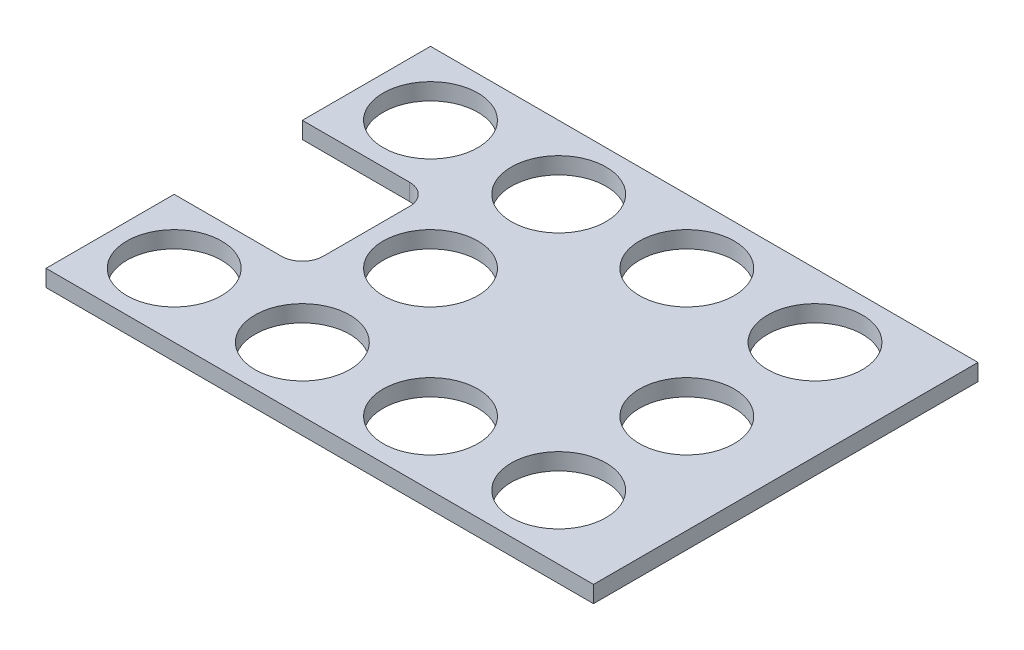
ISO-10303-21;
HEADER;
FILE_DESCRIPTION(('STEP AP214'),'2;1');
FILE_NAME('part.step','',(''),(''),'','','');
FILE_SCHEMA(('AUTOMOTIVE_DESIGN { 1 0 10303 214 1 1 1 1 }'));
ENDSEC;
DATA;
#1=APPLICATION_CONTEXT('core data for automotive mechanical design processes');
#2=APPLICATION_PROTOCOL_DEFINITION('international standard','automotive_design',2000,#1);
#3=PRODUCT_CONTEXT('',#1,'mechanical');
#4=PRODUCT('Part','Part','',(#3));
#5=PRODUCT_RELATED_PRODUCT_CATEGORY('part','',(#4));
#6=PRODUCT_DEFINITION_FORMATION('','',#4);
#7=PRODUCT_DEFINITION_CONTEXT('part definition',#1,'design');
#8=PRODUCT_DEFINITION('design','',#6,#7);
#9=PRODUCT_DEFINITION_SHAPE('','',#8);
#10=(LENGTH_UNIT() NAMED_UNIT(*) SI_UNIT(.MILLI.,.METRE.));
#11=(NAMED_UNIT(*) PLANE_ANGLE_UNIT() SI_UNIT($,.RADIAN.));
#12=(NAMED_UNIT(*) SI_UNIT($,.STERADIAN.) SOLID_ANGLE_UNIT());
#13=UNCERTAINTY_MEASURE_WITH_UNIT(LENGTH_MEASURE(1.E-05),#10,'distance_accuracy_value','');
#14=(GEOMETRIC_REPRESENTATION_CONTEXT(3) GLOBAL_UNCERTAINTY_ASSIGNED_CONTEXT((#13)) GLOBAL_UNIT_ASSIGNED_CONTEXT((#10,
#11,#12)) REPRESENTATION_CONTEXT('',''));
#15=CARTESIAN_POINT('',(0.,0.,0.));
#16=DIRECTION('',(0.,0.,1.));
#17=DIRECTION('',(1.,0.,0.));
#18=AXIS2_PLACEMENT_3D('',#15,#16,#17);
#19=CARTESIAN_POINT('',(0.,12.,0.));
#20=DIRECTION('',(-1.,0.,0.));
#21=DIRECTION('',(0.,0.,1.));
#22=AXIS2_PLACEMENT_3D('',#19,#20,#21);
#23=PLANE('',#22);
#24=DIRECTION('',(0.,0.,-1.));
#25=VECTOR('',#24,1.);
#26=CARTESIAN_POINT('',(0.,12.,0.));
#27=LINE('',#26,#25);
#28=CARTESIAN_POINT('',(0.,12.,0.));
#29=VERTEX_POINT('',#28);
#30=CARTESIAN_POINT('',(0.,12.,-92.));
#31=VERTEX_POINT('',#30);
#32=EDGE_CURVE('E234',#29,#31,#27,.T.);
#33=ORIENTED_EDGE('',*,*,#32,.T.);
#34=DIRECTION('',(0.,-1.,0.));
#35=VECTOR('',#34,1.);
#36=CARTESIAN_POINT('',(0.,142.107647738325,-92.));
#37=LINE('',#36,#35);
#38=CARTESIAN_POINT('',(0.,0.,-92.));
#39=VERTEX_POINT('',#38);
#40=EDGE_CURVE('E160',#31,#39,#37,.T.);
#41=ORIENTED_EDGE('',*,*,#40,.T.);
#42=DIRECTION('',(0.,0.,-1.));
#43=VECTOR('',#42,1.);
#44=CARTESIAN_POINT('',(0.,0.,0.));
#45=LINE('',#44,#43);
#46=CARTESIAN_POINT('',(0.,0.,0.));
#47=VERTEX_POINT('',#46);
#48=EDGE_CURVE('E228',#47,#39,#45,.T.);
#49=ORIENTED_EDGE('',*,*,#48,.F.);
#50=DIRECTION('',(0.,-1.,0.));
#51=VECTOR('',#50,1.);
#52=CARTESIAN_POINT('',(0.,12.,0.));
#53=LINE('',#52,#51);
#54=EDGE_CURVE('E57',#29,#47,#53,.T.);
#55=ORIENTED_EDGE('',*,*,#54,.F.);
#56=EDGE_LOOP('',(#33,#41,#49,#55));
#57=FACE_BOUND('',#56,.T.);
#58=ADVANCED_FACE('F33',(#57),#23,.T.);
#59=CARTESIAN_POINT('',(0.,12.,0.));
#60=DIRECTION('',(0.,0.,-1.));
#61=DIRECTION('',(-1.,0.,0.));
#62=AXIS2_PLACEMENT_3D('',#59,#60,#61);
#63=PLANE('',#62);
#64=DIRECTION('',(1.,0.,0.));
#65=VECTOR('',#64,1.);
#66=CARTESIAN_POINT('',(0.,0.,0.));
#67=LINE('',#66,#65);
#68=CARTESIAN_POINT('',(393.,0.,0.));
#69=VERTEX_POINT('',#68);
#70=EDGE_CURVE('E221',#47,#69,#67,.T.);
#71=ORIENTED_EDGE('',*,*,#70,.T.);
#72=DIRECTION('',(0.,-1.,0.));
#73=VECTOR('',#72,1.);
#74=CARTESIAN_POINT('',(393.,12.,0.));
#75=LINE('',#74,#73);
#76=CARTESIAN_POINT('',(393.,12.,0.));
#77=VERTEX_POINT('',#76);
#78=EDGE_CURVE('E11',#77,#69,#75,.T.);
#79=ORIENTED_EDGE('',*,*,#78,.F.);
#80=DIRECTION('',(1.,0.,0.));
#81=VECTOR('',#80,1.);
#82=CARTESIAN_POINT('',(0.,12.,0.));
#83=LINE('',#82,#81);
#84=EDGE_CURVE('E226',#29,#77,#83,.T.);
#85=ORIENTED_EDGE('',*,*,#84,.F.);
#86=ORIENTED_EDGE('',*,*,#54,.T.);
#87=EDGE_LOOP('',(#71,#79,#85,#86));
#88=FACE_BOUND('',#87,.T.);
#89=ADVANCED_FACE('F35',(#88),#63,.F.);
#90=CARTESIAN_POINT('',(393.,12.,0.));
#91=DIRECTION('',(-1.,0.,0.));
#92=DIRECTION('',(0.,0.,1.));
#93=AXIS2_PLACEMENT_3D('',#90,#91,#92);
#94=PLANE('',#93);
#95=DIRECTION('',(0.,0.,-1.));
#96=VECTOR('',#95,1.);
#97=CARTESIAN_POINT('',(393.,0.,0.));
#98=LINE('',#97,#96);
#99=CARTESIAN_POINT('',(393.,0.,-276.));
#100=VERTEX_POINT('',#99);
#101=EDGE_CURVE('E237',#69,#100,#98,.T.);
#102=ORIENTED_EDGE('',*,*,#101,.T.);
#103=DIRECTION('',(0.,-1.,0.));
#104=VECTOR('',#103,1.);
#105=CARTESIAN_POINT('',(393.,12.,-276.));
#106=LINE('',#105,#104);
#107=CARTESIAN_POINT('',(393.,12.,-276.));
#108=VERTEX_POINT('',#107);
#109=EDGE_CURVE('E41',#108,#100,#106,.T.);
#110=ORIENTED_EDGE('',*,*,#109,.F.);
#111=DIRECTION('',(0.,0.,-1.));
#112=VECTOR('',#111,1.);
#113=CARTESIAN_POINT('',(393.,12.,0.));
#114=LINE('',#113,#112);
#115=EDGE_CURVE('E83',#77,#108,#114,.T.);
#116=ORIENTED_EDGE('',*,*,#115,.F.);
#117=ORIENTED_EDGE('',*,*,#78,.T.);
#118=EDGE_LOOP('',(#102,#110,#116,#117));
#119=FACE_BOUND('',#118,.T.);
#120=ADVANCED_FACE('F254',(#119),#94,.F.);
#121=CARTESIAN_POINT('',(0.,12.,-276.));
#122=DIRECTION('',(0.,0.,-1.));
#123=DIRECTION('',(-1.,0.,0.));
#124=AXIS2_PLACEMENT_3D('',#121,#122,#123);
#125=PLANE('',#124);
#126=DIRECTION('',(1.,0.,0.));
#127=VECTOR('',#126,1.);
#128=CARTESIAN_POINT('',(0.,0.,-276.));
#129=LINE('',#128,#127);
#130=CARTESIAN_POINT('',(0.,0.,-276.));
#131=VERTEX_POINT('',#130);
#132=EDGE_CURVE('E240',#131,#100,#129,.T.);
#133=ORIENTED_EDGE('',*,*,#132,.F.);
#134=DIRECTION('',(0.,-1.,0.));
#135=VECTOR('',#134,1.);
#136=CARTESIAN_POINT('',(0.,12.,-276.));
#137=LINE('',#136,#135);
#138=CARTESIAN_POINT('',(0.,12.,-276.));
#139=VERTEX_POINT('',#138);
#140=EDGE_CURVE('E247',#139,#131,#137,.T.);
#141=ORIENTED_EDGE('',*,*,#140,.F.);
#142=DIRECTION('',(1.,0.,0.));
#143=VECTOR('',#142,1.);
#144=CARTESIAN_POINT('',(0.,12.,-276.));
#145=LINE('',#144,#143);
#146=EDGE_CURVE('E230',#139,#108,#145,.T.);
#147=ORIENTED_EDGE('',*,*,#146,.T.);
#148=ORIENTED_EDGE('',*,*,#109,.T.);
#149=EDGE_LOOP('',(#133,#141,#147,#148));
#150=FACE_BOUND('',#149,.T.);
#151=ADVANCED_FACE('F251',(#150),#125,.T.);
#152=DIRECTION('',(0.,-1.,0.));
#153=VECTOR('',#152,1.);
#154=CARTESIAN_POINT('',(0.,142.107647738325,-184.));
#155=LINE('',#154,#153);
#156=CARTESIAN_POINT('',(0.,12.,-184.));
#157=VERTEX_POINT('',#156);
#158=CARTESIAN_POINT('',(0.,0.,-184.));
#159=VERTEX_POINT('',#158);
#160=EDGE_CURVE('E154',#157,#159,#155,.T.);
#161=ORIENTED_EDGE('',*,*,#160,.F.);
#162=EDGE_CURVE('E233',#157,#139,#27,.T.);
#163=ORIENTED_EDGE('',*,*,#162,.T.);
#164=ORIENTED_EDGE('',*,*,#140,.T.);
#165=EDGE_CURVE('E243',#159,#131,#45,.T.);
#166=ORIENTED_EDGE('',*,*,#165,.F.);
#167=EDGE_LOOP('',(#161,#163,#164,#166));
#168=FACE_BOUND('',#167,.T.);
#169=ADVANCED_FACE('F264',(#168),#23,.T.);
#170=CARTESIAN_POINT('',(0.,12.,0.));
#171=DIRECTION('',(0.,1.,0.));
#172=DIRECTION('',(0.,0.,1.));
#173=AXIS2_PLACEMENT_3D('',#170,#171,#172);
#174=PLANE('',#173);
#175=CARTESIAN_POINT('',(77.,12.,-107.));
#176=DIRECTION('',(0.,1.,0.));
#177=DIRECTION('',(0.,0.,1.));
#178=AXIS2_PLACEMENT_3D('',#175,#176,#177);
#179=CIRCLE('',#178,15.);
#180=CARTESIAN_POINT('',(77.,12.,-92.));
#181=VERTEX_POINT('',#180);
#182=CARTESIAN_POINT('',(92.,12.0000000000001,-107.));
#183=VERTEX_POINT('',#182);
#184=EDGE_CURVE('E119',#181,#183,#179,.T.);
#185=ORIENTED_EDGE('',*,*,#184,.F.);
#186=DIRECTION('',(1.,0.,0.));
#187=VECTOR('',#186,1.);
#188=CARTESIAN_POINT('',(0.,12.,-92.));
#189=LINE('',#188,#187);
#190=EDGE_CURVE('E130',#31,#181,#189,.T.);
#191=ORIENTED_EDGE('',*,*,#190,.F.);
#192=ORIENTED_EDGE('',*,*,#32,.F.);
#193=ORIENTED_EDGE('',*,*,#84,.T.);
#194=ORIENTED_EDGE('',*,*,#115,.T.);
#195=ORIENTED_EDGE('',*,*,#146,.F.);
#196=ORIENTED_EDGE('',*,*,#162,.F.);
#197=DIRECTION('',(1.,0.,0.));
#198=VECTOR('',#197,1.);
#199=CARTESIAN_POINT('',(0.,12.,-184.));
#200=LINE('',#199,#198);
#201=CARTESIAN_POINT('',(77.,12.,-184.));
#202=VERTEX_POINT('',#201);
#203=EDGE_CURVE('E152',#157,#202,#200,.T.);
#204=ORIENTED_EDGE('',*,*,#203,.T.);
#205=CARTESIAN_POINT('',(77.,12.,-169.));
#206=DIRECTION('',(0.,1.,0.));
#207=DIRECTION('',(0.,0.,1.));
#208=AXIS2_PLACEMENT_3D('',#205,#206,#207);
#209=CIRCLE('',#208,15.);
#210=CARTESIAN_POINT('',(92.,12.,-169.));
#211=VERTEX_POINT('',#210);
#212=EDGE_CURVE('E144',#202,#211,#209,.F.);
#213=ORIENTED_EDGE('',*,*,#212,.T.);
#214=DIRECTION('',(0.,0.,1.));
#215=VECTOR('',#214,1.);
#216=CARTESIAN_POINT('',(92.,12.,0.));
#217=LINE('',#216,#215);
#218=EDGE_CURVE('E134',#211,#183,#217,.T.);
#219=ORIENTED_EDGE('',*,*,#218,.T.);
#220=EDGE_LOOP('',(#185,#191,#192,#193,#194,#195,#196,#204,#213,#219));
#221=FACE_BOUND('',#220,.T.);
#222=CARTESIAN_POINT('',(138.,12.,-138.));
#223=DIRECTION('',(0.,1.,0.));
#224=DIRECTION('',(0.,0.,1.));
#225=AXIS2_PLACEMENT_3D('',#222,#223,#224);
#226=CIRCLE('',#225,34.);
#227=CARTESIAN_POINT('',(138.,12.,-172.));
#228=VERTEX_POINT('',#227);
#229=EDGE_CURVE('E155',#228,#228,#226,.T.);
#230=ORIENTED_EDGE('',*,*,#229,.F.);
#231=EDGE_LOOP('',(#230));
#232=FACE_BOUND('',#231,.T.);
#233=CARTESIAN_POINT('',(322.,12.,-138.));
#234=DIRECTION('',(0.,1.,0.));
#235=DIRECTION('',(0.,0.,1.));
#236=AXIS2_PLACEMENT_3D('',#233,#234,#235);
#237=CIRCLE('',#236,34.);
#238=CARTESIAN_POINT('',(322.,12.,-172.));
#239=VERTEX_POINT('',#238);
#240=EDGE_CURVE('E170',#239,#239,#237,.T.);
#241=ORIENTED_EDGE('',*,*,#240,.F.);
#242=EDGE_LOOP('',(#241));
#243=FACE_BOUND('',#242,.T.);
#244=CARTESIAN_POINT('',(322.,12.,-46.));
#245=DIRECTION('',(0.,1.,0.));
#246=DIRECTION('',(0.,0.,1.));
#247=AXIS2_PLACEMENT_3D('',#244,#245,#246);
#248=CIRCLE('',#247,34.);
#249=CARTESIAN_POINT('',(322.,12.,-12.));
#250=VERTEX_POINT('',#249);
#251=EDGE_CURVE('E188',#250,#250,#248,.T.);
#252=ORIENTED_EDGE('',*,*,#251,.F.);
#253=EDGE_LOOP('',(#252));
#254=FACE_BOUND('',#253,.T.);
#255=CARTESIAN_POINT('',(230.,12.,-230.));
#256=DIRECTION('',(0.,1.,0.));
#257=DIRECTION('',(0.,0.,1.));
#258=AXIS2_PLACEMENT_3D('',#255,#256,#257);
#259=CIRCLE('',#258,34.);
#260=CARTESIAN_POINT('',(230.,12.,-264.));
#261=VERTEX_POINT('',#260);
#262=EDGE_CURVE('E187',#261,#261,#259,.T.);
#263=ORIENTED_EDGE('',*,*,#262,.F.);
#264=EDGE_LOOP('',(#263));
#265=FACE_BOUND('',#264,.T.);
#266=CARTESIAN_POINT('',(230.,12.,-46.));
#267=DIRECTION('',(0.,1.,0.));
#268=DIRECTION('',(0.,0.,1.));
#269=AXIS2_PLACEMENT_3D('',#266,#267,#268);
#270=CIRCLE('',#269,34.);
#271=CARTESIAN_POINT('',(230.,12.,-80.));
#272=VERTEX_POINT('',#271);
#273=EDGE_CURVE('E200',#272,#272,#270,.T.);
#274=ORIENTED_EDGE('',*,*,#273,.F.);
#275=EDGE_LOOP('',(#274));
#276=FACE_BOUND('',#275,.T.);
#277=CARTESIAN_POINT('',(138.,12.,-230.));
#278=DIRECTION('',(0.,1.,0.));
#279=DIRECTION('',(0.,0.,1.));
#280=AXIS2_PLACEMENT_3D('',#277,#278,#279);
#281=CIRCLE('',#280,34.);
#282=CARTESIAN_POINT('',(138.,12.,-196.));
#283=VERTEX_POINT('',#282);
#284=EDGE_CURVE('E199',#283,#283,#281,.T.);
#285=ORIENTED_EDGE('',*,*,#284,.F.);
#286=EDGE_LOOP('',(#285));
#287=FACE_BOUND('',#286,.T.);
#288=CARTESIAN_POINT('',(322.,12.,-230.));
#289=DIRECTION('',(0.,1.,0.));
#290=DIRECTION('',(0.,0.,1.));
#291=AXIS2_PLACEMENT_3D('',#288,#289,#290);
#292=CIRCLE('',#291,34.);
#293=CARTESIAN_POINT('',(322.,12.,-196.));
#294=VERTEX_POINT('',#293);
#295=EDGE_CURVE('E180',#294,#294,#292,.T.);
#296=ORIENTED_EDGE('',*,*,#295,.F.);
#297=EDGE_LOOP('',(#296));
#298=FACE_BOUND('',#297,.T.);
#299=CARTESIAN_POINT('',(138.,12.,-46.));
#300=DIRECTION('',(0.,1.,0.));
#301=DIRECTION('',(0.,0.,1.));
#302=AXIS2_PLACEMENT_3D('',#299,#300,#301);
#303=CIRCLE('',#302,34.);
#304=CARTESIAN_POINT('',(138.,12.,-12.));
#305=VERTEX_POINT('',#304);
#306=EDGE_CURVE('E210',#305,#305,#303,.T.);
#307=ORIENTED_EDGE('',*,*,#306,.F.);
#308=EDGE_LOOP('',(#307));
#309=FACE_BOUND('',#308,.T.);
#310=CARTESIAN_POINT('',(46.,12.,-46.));
#311=DIRECTION('',(0.,1.,0.));
#312=DIRECTION('',(0.,0.,1.));
#313=AXIS2_PLACEMENT_3D('',#310,#311,#312);
#314=CIRCLE('',#313,34.);
#315=CARTESIAN_POINT('',(46.,12.,-12.));
#316=VERTEX_POINT('',#315);
#317=EDGE_CURVE('E217',#316,#316,#314,.T.);
#318=ORIENTED_EDGE('',*,*,#317,.F.);
#319=EDGE_LOOP('',(#318));
#320=FACE_BOUND('',#319,.T.);
#321=CARTESIAN_POINT('',(46.,12.,-230.));
#322=DIRECTION('',(0.,1.,0.));
#323=DIRECTION('',(0.,0.,1.));
#324=AXIS2_PLACEMENT_3D('',#321,#322,#323);
#325=CIRCLE('',#324,34.);
#326=CARTESIAN_POINT('',(46.,12.,-196.));
#327=VERTEX_POINT('',#326);
#328=EDGE_CURVE('E213',#327,#327,#325,.T.);
#329=ORIENTED_EDGE('',*,*,#328,.F.);
#330=EDGE_LOOP('',(#329));
#331=FACE_BOUND('',#330,.T.);
#332=ADVANCED_FACE('F141',(#221,#232,#243,#254,#265,#276,#287,#298,#309,#320,#331),#174,.T.);
#333=CARTESIAN_POINT('',(0.,0.,0.));
#334=DIRECTION('',(0.,1.,0.));
#335=DIRECTION('',(0.,0.,1.));
#336=AXIS2_PLACEMENT_3D('',#333,#334,#335);
#337=PLANE('',#336);
#338=DIRECTION('',(1.,0.,0.));
#339=VECTOR('',#338,1.);
#340=CARTESIAN_POINT('',(0.,0.,-92.));
#341=LINE('',#340,#339);
#342=CARTESIAN_POINT('',(77.,0.,-92.));
#343=VERTEX_POINT('',#342);
#344=EDGE_CURVE('E159',#39,#343,#341,.T.);
#345=ORIENTED_EDGE('',*,*,#344,.T.);
#346=CARTESIAN_POINT('',(77.,0.,-107.));
#347=DIRECTION('',(0.,1.,0.));
#348=DIRECTION('',(0.,0.,1.));
#349=AXIS2_PLACEMENT_3D('',#346,#347,#348);
#350=CIRCLE('',#349,15.);
#351=CARTESIAN_POINT('',(92.,0.,-107.));
#352=VERTEX_POINT('',#351);
#353=EDGE_CURVE('E163',#343,#352,#350,.T.);
#354=ORIENTED_EDGE('',*,*,#353,.T.);
#355=DIRECTION('',(0.,0.,1.));
#356=VECTOR('',#355,1.);
#357=CARTESIAN_POINT('',(92.,0.,0.));
#358=LINE('',#357,#356);
#359=CARTESIAN_POINT('',(92.,0.,-169.));
#360=VERTEX_POINT('',#359);
#361=EDGE_CURVE('E137',#360,#352,#358,.T.);
#362=ORIENTED_EDGE('',*,*,#361,.F.);
#363=CARTESIAN_POINT('',(77.,0.,-169.));
#364=DIRECTION('',(0.,1.,0.));
#365=DIRECTION('',(0.,0.,1.));
#366=AXIS2_PLACEMENT_3D('',#363,#364,#365);
#367=CIRCLE('',#366,15.);
#368=CARTESIAN_POINT('',(77.,0.,-184.));
#369=VERTEX_POINT('',#368);
#370=EDGE_CURVE('E129',#369,#360,#367,.F.);
#371=ORIENTED_EDGE('',*,*,#370,.F.);
#372=DIRECTION('',(1.,0.,0.));
#373=VECTOR('',#372,1.);
#374=CARTESIAN_POINT('',(0.,0.,-184.));
#375=LINE('',#374,#373);
#376=EDGE_CURVE('E48',#159,#369,#375,.T.);
#377=ORIENTED_EDGE('',*,*,#376,.F.);
#378=ORIENTED_EDGE('',*,*,#165,.T.);
#379=ORIENTED_EDGE('',*,*,#132,.T.);
#380=ORIENTED_EDGE('',*,*,#101,.F.);
#381=ORIENTED_EDGE('',*,*,#70,.F.);
#382=ORIENTED_EDGE('',*,*,#48,.T.);
#383=EDGE_LOOP('',(#345,#354,#362,#371,#377,#378,#379,#380,#381,#382));
#384=FACE_BOUND('',#383,.T.);
#385=CARTESIAN_POINT('',(138.,0.,-138.));
#386=DIRECTION('',(0.,1.,0.));
#387=DIRECTION('',(0.,0.,1.));
#388=AXIS2_PLACEMENT_3D('',#385,#386,#387);
#389=CIRCLE('',#388,34.);
#390=CARTESIAN_POINT('',(138.,0.,-172.));
#391=VERTEX_POINT('',#390);
#392=EDGE_CURVE('E167',#391,#391,#389,.T.);
#393=ORIENTED_EDGE('',*,*,#392,.T.);
#394=EDGE_LOOP('',(#393));
#395=FACE_BOUND('',#394,.T.);
#396=CARTESIAN_POINT('',(322.,0.,-138.));
#397=DIRECTION('',(0.,1.,0.));
#398=DIRECTION('',(0.,0.,1.));
#399=AXIS2_PLACEMENT_3D('',#396,#397,#398);
#400=CIRCLE('',#399,34.);
#401=CARTESIAN_POINT('',(322.,0.,-172.));
#402=VERTEX_POINT('',#401);
#403=EDGE_CURVE('E173',#402,#402,#400,.T.);
#404=ORIENTED_EDGE('',*,*,#403,.T.);
#405=EDGE_LOOP('',(#404));
#406=FACE_BOUND('',#405,.T.);
#407=CARTESIAN_POINT('',(322.,0.,-46.));
#408=DIRECTION('',(0.,1.,0.));
#409=DIRECTION('',(0.,0.,1.));
#410=AXIS2_PLACEMENT_3D('',#407,#408,#409);
#411=CIRCLE('',#410,34.);
#412=CARTESIAN_POINT('',(322.,0.,-12.));
#413=VERTEX_POINT('',#412);
#414=EDGE_CURVE('E183',#413,#413,#411,.T.);
#415=ORIENTED_EDGE('',*,*,#414,.T.);
#416=EDGE_LOOP('',(#415));
#417=FACE_BOUND('',#416,.T.);
#418=CARTESIAN_POINT('',(230.,0.,-230.));
#419=DIRECTION('',(0.,1.,0.));
#420=DIRECTION('',(0.,0.,1.));
#421=AXIS2_PLACEMENT_3D('',#418,#419,#420);
#422=CIRCLE('',#421,34.);
#423=CARTESIAN_POINT('',(230.,0.,-264.));
#424=VERTEX_POINT('',#423);
#425=EDGE_CURVE('E184',#424,#424,#422,.T.);
#426=ORIENTED_EDGE('',*,*,#425,.T.);
#427=EDGE_LOOP('',(#426));
#428=FACE_BOUND('',#427,.T.);
#429=CARTESIAN_POINT('',(230.,0.,-46.));
#430=DIRECTION('',(0.,1.,0.));
#431=DIRECTION('',(0.,0.,1.));
#432=AXIS2_PLACEMENT_3D('',#429,#430,#431);
#433=CIRCLE('',#432,34.);
#434=CARTESIAN_POINT('',(230.,0.,-80.));
#435=VERTEX_POINT('',#434);
#436=EDGE_CURVE('E191',#435,#435,#433,.T.);
#437=ORIENTED_EDGE('',*,*,#436,.T.);
#438=EDGE_LOOP('',(#437));
#439=FACE_BOUND('',#438,.T.);
#440=CARTESIAN_POINT('',(138.,0.,-230.));
#441=DIRECTION('',(0.,1.,0.));
#442=DIRECTION('',(0.,0.,1.));
#443=AXIS2_PLACEMENT_3D('',#440,#441,#442);
#444=CIRCLE('',#443,34.);
#445=CARTESIAN_POINT('',(138.,0.,-196.));
#446=VERTEX_POINT('',#445);
#447=EDGE_CURVE('E196',#446,#446,#444,.T.);
#448=ORIENTED_EDGE('',*,*,#447,.T.);
#449=EDGE_LOOP('',(#448));
#450=FACE_BOUND('',#449,.T.);
#451=CARTESIAN_POINT('',(322.,0.,-230.));
#452=DIRECTION('',(0.,1.,0.));
#453=DIRECTION('',(0.,0.,1.));
#454=AXIS2_PLACEMENT_3D('',#451,#452,#453);
#455=CIRCLE('',#454,34.);
#456=CARTESIAN_POINT('',(322.,0.,-196.));
#457=VERTEX_POINT('',#456);
#458=EDGE_CURVE('E166',#457,#457,#455,.T.);
#459=ORIENTED_EDGE('',*,*,#458,.T.);
#460=EDGE_LOOP('',(#459));
#461=FACE_BOUND('',#460,.T.);
#462=CARTESIAN_POINT('',(138.,0.,-46.));
#463=DIRECTION('',(0.,1.,0.));
#464=DIRECTION('',(0.,0.,1.));
#465=AXIS2_PLACEMENT_3D('',#462,#463,#464);
#466=CIRCLE('',#465,34.);
#467=CARTESIAN_POINT('',(138.,0.,-12.));
#468=VERTEX_POINT('',#467);
#469=EDGE_CURVE('E203',#468,#468,#466,.T.);
#470=ORIENTED_EDGE('',*,*,#469,.T.);
#471=EDGE_LOOP('',(#470));
#472=FACE_BOUND('',#471,.T.);
#473=CARTESIAN_POINT('',(46.,0.,-46.));
#474=DIRECTION('',(0.,1.,0.));
#475=DIRECTION('',(0.,0.,1.));
#476=AXIS2_PLACEMENT_3D('',#473,#474,#475);
#477=CIRCLE('',#476,34.);
#478=CARTESIAN_POINT('',(46.,0.,-12.));
#479=VERTEX_POINT('',#478);
#480=EDGE_CURVE('E214',#479,#479,#477,.T.);
#481=ORIENTED_EDGE('',*,*,#480,.T.);
#482=EDGE_LOOP('',(#481));
#483=FACE_BOUND('',#482,.T.);
#484=CARTESIAN_POINT('',(46.,0.,-230.));
#485=DIRECTION('',(0.,1.,0.));
#486=DIRECTION('',(0.,0.,1.));
#487=AXIS2_PLACEMENT_3D('',#484,#485,#486);
#488=CIRCLE('',#487,34.);
#489=CARTESIAN_POINT('',(46.,0.,-196.));
#490=VERTEX_POINT('',#489);
#491=EDGE_CURVE('E218',#490,#490,#488,.T.);
#492=ORIENTED_EDGE('',*,*,#491,.T.);
#493=EDGE_LOOP('',(#492));
#494=FACE_BOUND('',#493,.T.);
#495=ADVANCED_FACE('F258',(#384,#395,#406,#417,#428,#439,#450,#461,#472,#483,#494),#337,.F.);
#496=CARTESIAN_POINT('',(46.,108.16652224137,-230.));
#497=DIRECTION('',(0.,-1.,0.));
#498=DIRECTION('',(0.,0.,-1.));
#499=AXIS2_PLACEMENT_3D('',#496,#497,#498);
#500=CYLINDRICAL_SURFACE('',#499,34.);
#501=ORIENTED_EDGE('',*,*,#491,.F.);
#502=EDGE_LOOP('',(#501));
#503=FACE_BOUND('',#502,.T.);
#504=ORIENTED_EDGE('',*,*,#328,.T.);
#505=EDGE_LOOP('',(#504));
#506=FACE_BOUND('',#505,.T.);
#507=ADVANCED_FACE('F332',(#503,#506),#500,.F.);
#508=CARTESIAN_POINT('',(46.,108.16652224137,-46.));
#509=DIRECTION('',(0.,-1.,0.));
#510=DIRECTION('',(0.,0.,-1.));
#511=AXIS2_PLACEMENT_3D('',#508,#509,#510);
#512=CYLINDRICAL_SURFACE('',#511,34.);
#513=ORIENTED_EDGE('',*,*,#480,.F.);
#514=EDGE_LOOP('',(#513));
#515=FACE_BOUND('',#514,.T.);
#516=ORIENTED_EDGE('',*,*,#317,.T.);
#517=EDGE_LOOP('',(#516));
#518=FACE_BOUND('',#517,.T.);
#519=ADVANCED_FACE('F339',(#515,#518),#512,.F.);
#520=CARTESIAN_POINT('',(138.,108.16652224137,-46.));
#521=DIRECTION('',(0.,-1.,0.));
#522=DIRECTION('',(0.,0.,-1.));
#523=AXIS2_PLACEMENT_3D('',#520,#521,#522);
#524=CYLINDRICAL_SURFACE('',#523,34.);
#525=ORIENTED_EDGE('',*,*,#469,.F.);
#526=EDGE_LOOP('',(#525));
#527=FACE_BOUND('',#526,.T.);
#528=ORIENTED_EDGE('',*,*,#306,.T.);
#529=EDGE_LOOP('',(#528));
#530=FACE_BOUND('',#529,.T.);
#531=ADVANCED_FACE('F348',(#527,#530),#524,.F.);
#532=CARTESIAN_POINT('',(322.,108.16652224137,-230.));
#533=DIRECTION('',(0.,-1.,0.));
#534=DIRECTION('',(0.,0.,-1.));
#535=AXIS2_PLACEMENT_3D('',#532,#533,#534);
#536=CYLINDRICAL_SURFACE('',#535,34.);
#537=ORIENTED_EDGE('',*,*,#458,.F.);
#538=EDGE_LOOP('',(#537));
#539=FACE_BOUND('',#538,.T.);
#540=ORIENTED_EDGE('',*,*,#295,.T.);
#541=EDGE_LOOP('',(#540));
#542=FACE_BOUND('',#541,.T.);
#543=ADVANCED_FACE('F357',(#539,#542),#536,.F.);
#544=CARTESIAN_POINT('',(138.,108.16652224137,-230.));
#545=DIRECTION('',(0.,-1.,0.));
#546=DIRECTION('',(0.,0.,-1.));
#547=AXIS2_PLACEMENT_3D('',#544,#545,#546);
#548=CYLINDRICAL_SURFACE('',#547,34.);
#549=ORIENTED_EDGE('',*,*,#447,.F.);
#550=EDGE_LOOP('',(#549));
#551=FACE_BOUND('',#550,.T.);
#552=ORIENTED_EDGE('',*,*,#284,.T.);
#553=EDGE_LOOP('',(#552));
#554=FACE_BOUND('',#553,.T.);
#555=ADVANCED_FACE('F366',(#551,#554),#548,.F.);
#556=CARTESIAN_POINT('',(230.,108.166522241371,-46.));
#557=DIRECTION('',(0.,-1.,0.));
#558=DIRECTION('',(0.,0.,-1.));
#559=AXIS2_PLACEMENT_3D('',#556,#557,#558);
#560=CYLINDRICAL_SURFACE('',#559,34.);
#561=CARTESIAN_POINT('',(230.,0.,-80.));
#562=CARTESIAN_POINT('',(230.,0.124999999999986,-80.));
#563=CARTESIAN_POINT('',(230.,0.249999999999986,-80.));
#564=CARTESIAN_POINT('',(230.,0.499999999999987,-80.));
#565=CARTESIAN_POINT('',(230.,0.624999999999987,-80.));
#566=CARTESIAN_POINT('',(230.,0.874999999999987,-80.));
#567=CARTESIAN_POINT('',(230.,0.999999999999987,-80.));
#568=CARTESIAN_POINT('',(230.,1.24999999999999,-80.));
#569=CARTESIAN_POINT('',(230.,1.37499999999999,-80.));
#570=CARTESIAN_POINT('',(230.,1.62499999999999,-80.));
#571=CARTESIAN_POINT('',(230.,1.74999999999999,-80.));
#572=CARTESIAN_POINT('',(230.,1.99999999999999,-80.));
#573=CARTESIAN_POINT('',(230.,2.12499999999999,-80.));
#574=CARTESIAN_POINT('',(230.,2.37499999999999,-80.));
#575=CARTESIAN_POINT('',(230.,2.49999999999999,-80.));
#576=CARTESIAN_POINT('',(230.,2.74999999999999,-80.));
#577=CARTESIAN_POINT('',(230.,2.87499999999999,-80.));
#578=CARTESIAN_POINT('',(230.,3.12499999999999,-80.));
#579=CARTESIAN_POINT('',(230.,3.24999999999999,-80.));
#580=CARTESIAN_POINT('',(230.,3.49999999999999,-80.));
#581=CARTESIAN_POINT('',(230.,3.62499999999999,-80.));
#582=CARTESIAN_POINT('',(230.,3.87499999999999,-80.));
#583=CARTESIAN_POINT('',(230.,3.99999999999999,-80.));
#584=CARTESIAN_POINT('',(230.,4.24999999999999,-80.));
#585=CARTESIAN_POINT('',(230.,4.37499999999999,-80.));
#586=CARTESIAN_POINT('',(230.,4.62499999999999,-80.));
#587=CARTESIAN_POINT('',(230.,4.74999999999999,-80.));
#588=CARTESIAN_POINT('',(230.,4.99999999999999,-80.));
#589=CARTESIAN_POINT('',(230.,5.12499999999999,-80.));
#590=CARTESIAN_POINT('',(230.,5.37499999999999,-80.));
#591=CARTESIAN_POINT('',(230.,5.49999999999999,-80.));
#592=CARTESIAN_POINT('',(230.,5.74999999999999,-80.));
#593=CARTESIAN_POINT('',(230.,5.87499999999999,-80.));
#594=CARTESIAN_POINT('',(230.,6.12499999999999,-80.));
#595=CARTESIAN_POINT('',(230.,6.24999999999999,-80.));
#596=CARTESIAN_POINT('',(230.,6.49999999999999,-80.));
#597=CARTESIAN_POINT('',(230.,6.62499999999999,-80.));
#598=CARTESIAN_POINT('',(230.,6.87499999999999,-80.));
#599=CARTESIAN_POINT('',(230.,6.99999999999999,-80.));
#600=CARTESIAN_POINT('',(230.,7.24999999999999,-80.));
#601=CARTESIAN_POINT('',(230.,7.37499999999999,-80.));
#602=CARTESIAN_POINT('',(230.,7.62499999999999,-80.));
#603=CARTESIAN_POINT('',(230.,7.74999999999999,-80.));
#604=CARTESIAN_POINT('',(230.,7.99999999999999,-80.));
#605=CARTESIAN_POINT('',(230.,8.12499999999999,-80.));
#606=CARTESIAN_POINT('',(230.,8.37499999999999,-80.));
#607=CARTESIAN_POINT('',(230.,8.49999999999999,-80.));
#608=CARTESIAN_POINT('',(230.,8.74999999999999,-80.));
#609=CARTESIAN_POINT('',(230.,8.87499999999999,-80.));
#610=CARTESIAN_POINT('',(230.,9.12499999999999,-80.));
#611=CARTESIAN_POINT('',(230.,9.24999999999999,-80.));
#612=CARTESIAN_POINT('',(230.,9.49999999999999,-80.));
#613=CARTESIAN_POINT('',(230.,9.62499999999999,-80.));
#614=CARTESIAN_POINT('',(230.,9.87499999999999,-80.));
#615=CARTESIAN_POINT('',(230.,9.99999999999999,-80.));
#616=CARTESIAN_POINT('',(230.,10.25,-80.));
#617=CARTESIAN_POINT('',(230.,10.375,-80.));
#618=CARTESIAN_POINT('',(230.,10.625,-80.));
#619=CARTESIAN_POINT('',(230.,10.75,-80.));
#620=CARTESIAN_POINT('',(230.,11.,-80.));
#621=CARTESIAN_POINT('',(230.,11.125,-80.));
#622=CARTESIAN_POINT('',(230.,11.375,-80.));
#623=CARTESIAN_POINT('',(230.,11.5,-80.));
#624=CARTESIAN_POINT('',(230.,11.75,-80.));
#625=CARTESIAN_POINT('',(230.,11.875,-80.));
#626=CARTESIAN_POINT('',(230.,12.,-80.));
#627=B_SPLINE_CURVE_WITH_KNOTS('',3,(#561,#562,#563,#564,#565,#566,#567,#568,#569,#570,#571,
#572,#573,#574,#575,#576,#577,#578,#579,#580,#581,#582,#583,#584,#585,#586,#587,#588,#589,#590,
#591,#592,#593,#594,#595,#596,#597,#598,#599,#600,#601,#602,#603,#604,#605,#606,#607,#608,#609,
#610,#611,#612,#613,#614,#615,#616,#617,#618,#619,#620,#621,#622,#623,#624,#625,#626),
.UNSPECIFIED.,.F.,.F.,(4,2,2,2,2,2,2,2,2,2,2,2,2,2,2,2,2,2,2,2,2,2,2,2,2,2,2,2,2,2,2,2,4),(0.,
0.375,0.750000000000001,1.125,1.5,1.875,2.25,2.625,3.,3.375,3.75,4.125,4.5,4.875,5.25,
5.62500000000001,6.00000000000001,6.37500000000001,6.75000000000001,7.12500000000001,
7.50000000000001,7.87500000000001,8.25000000000001,8.62500000000001,9.00000000000001,
9.37500000000001,9.75000000000001,10.125,10.5,10.875,11.25,11.625,12.),.UNSPECIFIED.);
#628=EDGE_CURVE('BSEAM375',#435,#272,#627,.T.);
#629=ORIENTED_EDGE('',*,*,#436,.F.);
#630=ORIENTED_EDGE('',*,*,#273,.T.);
#631=ORIENTED_EDGE('',*,*,#628,.T.);
#632=ORIENTED_EDGE('',*,*,#628,.F.);
#633=EDGE_LOOP('',(#629,#631,#630,#632));
#634=FACE_BOUND('',#633,.T.);
#635=ADVANCED_FACE('F375',(#634),#560,.F.);
#636=CARTESIAN_POINT('',(230.,108.166522241371,-230.));
#637=DIRECTION('',(0.,-1.,0.));
#638=DIRECTION('',(0.,0.,-1.));
#639=AXIS2_PLACEMENT_3D('',#636,#637,#638);
#640=CYLINDRICAL_SURFACE('',#639,34.);
#641=CARTESIAN_POINT('',(230.,0.,-264.));
#642=CARTESIAN_POINT('',(230.,0.124999999999986,-264.));
#643=CARTESIAN_POINT('',(230.,0.249999999999986,-264.));
#644=CARTESIAN_POINT('',(230.,0.499999999999987,-264.));
#645=CARTESIAN_POINT('',(230.,0.624999999999987,-264.));
#646=CARTESIAN_POINT('',(230.,0.874999999999987,-264.));
#647=CARTESIAN_POINT('',(230.,0.999999999999987,-264.));
#648=CARTESIAN_POINT('',(230.,1.24999999999999,-264.));
#649=CARTESIAN_POINT('',(230.,1.37499999999999,-264.));
#650=CARTESIAN_POINT('',(230.,1.62499999999999,-264.));
#651=CARTESIAN_POINT('',(230.,1.74999999999999,-264.));
#652=CARTESIAN_POINT('',(230.,1.99999999999999,-264.));
#653=CARTESIAN_POINT('',(230.,2.12499999999999,-264.));
#654=CARTESIAN_POINT('',(230.,2.37499999999999,-264.));
#655=CARTESIAN_POINT('',(230.,2.49999999999999,-264.));
#656=CARTESIAN_POINT('',(230.,2.74999999999999,-264.));
#657=CARTESIAN_POINT('',(230.,2.87499999999999,-264.));
#658=CARTESIAN_POINT('',(230.,3.12499999999999,-264.));
#659=CARTESIAN_POINT('',(230.,3.24999999999999,-264.));
#660=CARTESIAN_POINT('',(230.,3.49999999999999,-264.));
#661=CARTESIAN_POINT('',(230.,3.62499999999999,-264.));
#662=CARTESIAN_POINT('',(230.,3.87499999999999,-264.));
#663=CARTESIAN_POINT('',(230.,3.99999999999999,-264.));
#664=CARTESIAN_POINT('',(230.,4.24999999999999,-264.));
#665=CARTESIAN_POINT('',(230.,4.37499999999999,-264.));
#666=CARTESIAN_POINT('',(230.,4.62499999999999,-264.));
#667=CARTESIAN_POINT('',(230.,4.74999999999999,-264.));
#668=CARTESIAN_POINT('',(230.,4.99999999999999,-264.));
#669=CARTESIAN_POINT('',(230.,5.12499999999999,-264.));
#670=CARTESIAN_POINT('',(230.,5.37499999999999,-264.));
#671=CARTESIAN_POINT('',(230.,5.49999999999999,-264.));
#672=CARTESIAN_POINT('',(230.,5.74999999999999,-264.));
#673=CARTESIAN_POINT('',(230.,5.87499999999999,-264.));
#674=CARTESIAN_POINT('',(230.,6.12499999999999,-264.));
#675=CARTESIAN_POINT('',(230.,6.24999999999999,-264.));
#676=CARTESIAN_POINT('',(230.,6.49999999999999,-264.));
#677=CARTESIAN_POINT('',(230.,6.62499999999999,-264.));
#678=CARTESIAN_POINT('',(230.,6.87499999999999,-264.));
#679=CARTESIAN_POINT('',(230.,6.99999999999999,-264.));
#680=CARTESIAN_POINT('',(230.,7.24999999999999,-264.));
#681=CARTESIAN_POINT('',(230.,7.37499999999999,-264.));
#682=CARTESIAN_POINT('',(230.,7.62499999999999,-264.));
#683=CARTESIAN_POINT('',(230.,7.74999999999999,-264.));
#684=CARTESIAN_POINT('',(230.,7.99999999999999,-264.));
#685=CARTESIAN_POINT('',(230.,8.12499999999999,-264.));
#686=CARTESIAN_POINT('',(230.,8.37499999999999,-264.));
#687=CARTESIAN_POINT('',(230.,8.49999999999999,-264.));
#688=CARTESIAN_POINT('',(230.,8.74999999999999,-264.));
#689=CARTESIAN_POINT('',(230.,8.87499999999999,-264.));
#690=CARTESIAN_POINT('',(230.,9.12499999999999,-264.));
#691=CARTESIAN_POINT('',(230.,9.24999999999999,-264.));
#692=CARTESIAN_POINT('',(230.,9.49999999999999,-264.));
#693=CARTESIAN_POINT('',(230.,9.62499999999999,-264.));
#694=CARTESIAN_POINT('',(230.,9.87499999999999,-264.));
#695=CARTESIAN_POINT('',(230.,9.99999999999999,-264.));
#696=CARTESIAN_POINT('',(230.,10.25,-264.));
#697=CARTESIAN_POINT('',(230.,10.375,-264.));
#698=CARTESIAN_POINT('',(230.,10.625,-264.));
#699=CARTESIAN_POINT('',(230.,10.75,-264.));
#700=CARTESIAN_POINT('',(230.,11.,-264.));
#701=CARTESIAN_POINT('',(230.,11.125,-264.));
#702=CARTESIAN_POINT('',(230.,11.375,-264.));
#703=CARTESIAN_POINT('',(230.,11.5,-264.));
#704=CARTESIAN_POINT('',(230.,11.75,-264.));
#705=CARTESIAN_POINT('',(230.,11.875,-264.));
#706=CARTESIAN_POINT('',(230.,12.,-264.));
#707=B_SPLINE_CURVE_WITH_KNOTS('',3,(#641,#642,#643,#644,#645,#646,#647,#648,#649,#650,#651,
#652,#653,#654,#655,#656,#657,#658,#659,#660,#661,#662,#663,#664,#665,#666,#667,#668,#669,#670,
#671,#672,#673,#674,#675,#676,#677,#678,#679,#680,#681,#682,#683,#684,#685,#686,#687,#688,#689,
#690,#691,#692,#693,#694,#695,#696,#697,#698,#699,#700,#701,#702,#703,#704,#705,#706),
.UNSPECIFIED.,.F.,.F.,(4,2,2,2,2,2,2,2,2,2,2,2,2,2,2,2,2,2,2,2,2,2,2,2,2,2,2,2,2,2,2,2,4),(0.,
0.375,0.750000000000001,1.125,1.5,1.875,2.25,2.625,3.,3.375,3.75,4.125,4.5,4.875,5.25,
5.62500000000001,6.00000000000001,6.37500000000001,6.75000000000001,7.12500000000001,
7.50000000000001,7.87500000000001,8.25000000000001,8.62500000000001,9.00000000000001,
9.37500000000001,9.75000000000001,10.125,10.5,10.875,11.25,11.625,12.),.UNSPECIFIED.);
#708=EDGE_CURVE('BSEAM384',#424,#261,#707,.T.);
#709=ORIENTED_EDGE('',*,*,#425,.F.);
#710=ORIENTED_EDGE('',*,*,#262,.T.);
#711=ORIENTED_EDGE('',*,*,#708,.T.);
#712=ORIENTED_EDGE('',*,*,#708,.F.);
#713=EDGE_LOOP('',(#709,#711,#710,#712));
#714=FACE_BOUND('',#713,.T.);
#715=ADVANCED_FACE('F384',(#714),#640,.F.);
#716=CARTESIAN_POINT('',(322.,108.16652224137,-46.));
#717=DIRECTION('',(0.,-1.,0.));
#718=DIRECTION('',(0.,0.,-1.));
#719=AXIS2_PLACEMENT_3D('',#716,#717,#718);
#720=CYLINDRICAL_SURFACE('',#719,34.);
#721=ORIENTED_EDGE('',*,*,#414,.F.);
#722=EDGE_LOOP('',(#721));
#723=FACE_BOUND('',#722,.T.);
#724=ORIENTED_EDGE('',*,*,#251,.T.);
#725=EDGE_LOOP('',(#724));
#726=FACE_BOUND('',#725,.T.);
#727=ADVANCED_FACE('F393',(#723,#726),#720,.F.);
#728=CARTESIAN_POINT('',(322.,142.107647738325,-138.));
#729=DIRECTION('',(0.,-1.,0.));
#730=DIRECTION('',(0.,0.,-1.));
#731=AXIS2_PLACEMENT_3D('',#728,#729,#730);
#732=CYLINDRICAL_SURFACE('',#731,34.);
#733=CARTESIAN_POINT('',(322.,0.,-172.));
#734=CARTESIAN_POINT('',(322.,0.124999999999977,-172.));
#735=CARTESIAN_POINT('',(322.,0.249999999999982,-172.));
#736=CARTESIAN_POINT('',(322.,0.499999999999982,-172.));
#737=CARTESIAN_POINT('',(322.,0.624999999999977,-172.));
#738=CARTESIAN_POINT('',(322.,0.874999999999968,-172.));
#739=CARTESIAN_POINT('',(322.,0.999999999999964,-172.));
#740=CARTESIAN_POINT('',(322.,1.24999999999996,-172.));
#741=CARTESIAN_POINT('',(322.,1.37499999999997,-172.));
#742=CARTESIAN_POINT('',(322.,1.62499999999998,-172.));
#743=CARTESIAN_POINT('',(322.,1.74999999999998,-172.));
#744=CARTESIAN_POINT('',(322.,1.99999999999998,-172.));
#745=CARTESIAN_POINT('',(322.,2.12499999999998,-172.));
#746=CARTESIAN_POINT('',(322.,2.37499999999997,-172.));
#747=CARTESIAN_POINT('',(322.,2.49999999999997,-172.));
#748=CARTESIAN_POINT('',(322.,2.74999999999997,-172.));
#749=CARTESIAN_POINT('',(322.,2.87499999999997,-172.));
#750=CARTESIAN_POINT('',(322.,3.12499999999998,-172.));
#751=CARTESIAN_POINT('',(322.,3.24999999999998,-172.));
#752=CARTESIAN_POINT('',(322.,3.49999999999998,-172.));
#753=CARTESIAN_POINT('',(322.,3.62499999999998,-172.));
#754=CARTESIAN_POINT('',(322.,3.87499999999997,-172.));
#755=CARTESIAN_POINT('',(322.,3.99999999999997,-172.));
#756=CARTESIAN_POINT('',(322.,4.24999999999997,-172.));
#757=CARTESIAN_POINT('',(322.,4.37499999999997,-172.));
#758=CARTESIAN_POINT('',(322.,4.62499999999998,-172.));
#759=CARTESIAN_POINT('',(322.,4.74999999999999,-172.));
#760=CARTESIAN_POINT('',(322.,4.99999999999999,-172.));
#761=CARTESIAN_POINT('',(322.,5.12499999999998,-172.));
#762=CARTESIAN_POINT('',(322.,5.37499999999997,-172.));
#763=CARTESIAN_POINT('',(322.,5.49999999999997,-172.));
#764=CARTESIAN_POINT('',(322.,5.74999999999997,-172.));
#765=CARTESIAN_POINT('',(322.,5.87499999999997,-172.));
#766=CARTESIAN_POINT('',(322.,6.12499999999998,-172.));
#767=CARTESIAN_POINT('',(322.,6.24999999999999,-172.));
#768=CARTESIAN_POINT('',(322.,6.49999999999999,-172.));
#769=CARTESIAN_POINT('',(322.,6.62499999999998,-172.));
#770=CARTESIAN_POINT('',(322.,6.87499999999997,-172.));
#771=CARTESIAN_POINT('',(322.,6.99999999999997,-172.));
#772=CARTESIAN_POINT('',(322.,7.24999999999997,-172.));
#773=CARTESIAN_POINT('',(322.,7.37499999999997,-172.));
#774=CARTESIAN_POINT('',(322.,7.62499999999998,-172.));
#775=CARTESIAN_POINT('',(322.,7.74999999999999,-172.));
#776=CARTESIAN_POINT('',(322.,7.99999999999999,-172.));
#777=CARTESIAN_POINT('',(322.,8.12499999999998,-172.));
#778=CARTESIAN_POINT('',(322.,8.37499999999998,-172.));
#779=CARTESIAN_POINT('',(322.,8.49999999999997,-172.));
#780=CARTESIAN_POINT('',(322.,8.74999999999997,-172.));
#781=CARTESIAN_POINT('',(322.,8.87499999999998,-172.));
#782=CARTESIAN_POINT('',(322.,9.12499999999999,-172.));
#783=CARTESIAN_POINT('',(322.,9.24999999999999,-172.));
#784=CARTESIAN_POINT('',(322.,9.49999999999999,-172.));
#785=CARTESIAN_POINT('',(322.,9.62499999999999,-172.));
#786=CARTESIAN_POINT('',(322.,9.87499999999998,-172.));
#787=CARTESIAN_POINT('',(322.,9.99999999999997,-172.));
#788=CARTESIAN_POINT('',(322.,10.25,-172.));
#789=CARTESIAN_POINT('',(322.,10.375,-172.));
#790=CARTESIAN_POINT('',(322.,10.625,-172.));
#791=CARTESIAN_POINT('',(322.,10.75,-172.));
#792=CARTESIAN_POINT('',(322.,11.,-172.));
#793=CARTESIAN_POINT('',(322.,11.125,-172.));
#794=CARTESIAN_POINT('',(322.,11.375,-172.));
#795=CARTESIAN_POINT('',(322.,11.5,-172.));
#796=CARTESIAN_POINT('',(322.,11.75,-172.));
#797=CARTESIAN_POINT('',(322.,11.875,-172.));
#798=CARTESIAN_POINT('',(322.,12.,-172.));
#799=B_SPLINE_CURVE_WITH_KNOTS('',3,(#733,#734,#735,#736,#737,#738,#739,#740,#741,#742,#743,
#744,#745,#746,#747,#748,#749,#750,#751,#752,#753,#754,#755,#756,#757,#758,#759,#760,#761,#762,
#763,#764,#765,#766,#767,#768,#769,#770,#771,#772,#773,#774,#775,#776,#777,#778,#779,#780,#781,
#782,#783,#784,#785,#786,#787,#788,#789,#790,#791,#792,#793,#794,#795,#796,#797,#798),
.UNSPECIFIED.,.F.,.F.,(4,2,2,2,2,2,2,2,2,2,2,2,2,2,2,2,2,2,2,2,2,2,2,2,2,2,2,2,2,2,2,2,4),(0.,
0.375000000000014,0.750000000000001,1.12499999999999,1.5,1.87500000000002,2.25,2.62499999999999,
3.,3.37500000000002,3.75,4.12499999999999,4.5,4.87500000000002,5.25,5.62499999999999,
6.00000000000001,6.37500000000002,6.75000000000001,7.12499999999999,7.50000000000001,
7.87500000000002,8.25000000000001,8.62499999999999,9.00000000000001,9.37500000000002,
9.75000000000001,10.125,10.5,10.875,11.25,11.625,12.),.UNSPECIFIED.);
#800=EDGE_CURVE('BSEAM402',#402,#239,#799,.T.);
#801=ORIENTED_EDGE('',*,*,#403,.F.);
#802=ORIENTED_EDGE('',*,*,#240,.T.);
#803=ORIENTED_EDGE('',*,*,#800,.T.);
#804=ORIENTED_EDGE('',*,*,#800,.F.);
#805=EDGE_LOOP('',(#801,#803,#802,#804));
#806=FACE_BOUND('',#805,.T.);
#807=ADVANCED_FACE('F402',(#806),#732,.F.);
#808=CARTESIAN_POINT('',(138.,142.107647738325,-138.));
#809=DIRECTION('',(0.,-1.,0.));
#810=DIRECTION('',(0.,0.,-1.));
#811=AXIS2_PLACEMENT_3D('',#808,#809,#810);
#812=CYLINDRICAL_SURFACE('',#811,34.);
#813=CARTESIAN_POINT('',(138.,0.,-172.));
#814=CARTESIAN_POINT('',(138.,0.124999999999977,-172.));
#815=CARTESIAN_POINT('',(138.,0.249999999999982,-172.));
#816=CARTESIAN_POINT('',(138.,0.499999999999982,-172.));
#817=CARTESIAN_POINT('',(138.,0.624999999999977,-172.));
#818=CARTESIAN_POINT('',(138.,0.874999999999968,-172.));
#819=CARTESIAN_POINT('',(138.,0.999999999999964,-172.));
#820=CARTESIAN_POINT('',(138.,1.24999999999996,-172.));
#821=CARTESIAN_POINT('',(138.,1.37499999999997,-172.));
#822=CARTESIAN_POINT('',(138.,1.62499999999998,-172.));
#823=CARTESIAN_POINT('',(138.,1.74999999999998,-172.));
#824=CARTESIAN_POINT('',(138.,1.99999999999998,-172.));
#825=CARTESIAN_POINT('',(138.,2.12499999999998,-172.));
#826=CARTESIAN_POINT('',(138.,2.37499999999997,-172.));
#827=CARTESIAN_POINT('',(138.,2.49999999999997,-172.));
#828=CARTESIAN_POINT('',(138.,2.74999999999997,-172.));
#829=CARTESIAN_POINT('',(138.,2.87499999999997,-172.));
#830=CARTESIAN_POINT('',(138.,3.12499999999998,-172.));
#831=CARTESIAN_POINT('',(138.,3.24999999999998,-172.));
#832=CARTESIAN_POINT('',(138.,3.49999999999998,-172.));
#833=CARTESIAN_POINT('',(138.,3.62499999999998,-172.));
#834=CARTESIAN_POINT('',(138.,3.87499999999997,-172.));
#835=CARTESIAN_POINT('',(138.,3.99999999999997,-172.));
#836=CARTESIAN_POINT('',(138.,4.24999999999997,-172.));
#837=CARTESIAN_POINT('',(138.,4.37499999999997,-172.));
#838=CARTESIAN_POINT('',(138.,4.62499999999998,-172.));
#839=CARTESIAN_POINT('',(138.,4.74999999999999,-172.));
#840=CARTESIAN_POINT('',(138.,4.99999999999999,-172.));
#841=CARTESIAN_POINT('',(138.,5.12499999999998,-172.));
#842=CARTESIAN_POINT('',(138.,5.37499999999997,-172.));
#843=CARTESIAN_POINT('',(138.,5.49999999999997,-172.));
#844=CARTESIAN_POINT('',(138.,5.74999999999997,-172.));
#845=CARTESIAN_POINT('',(138.,5.87499999999997,-172.));
#846=CARTESIAN_POINT('',(138.,6.12499999999998,-172.));
#847=CARTESIAN_POINT('',(138.,6.24999999999999,-172.));
#848=CARTESIAN_POINT('',(138.,6.49999999999999,-172.));
#849=CARTESIAN_POINT('',(138.,6.62499999999998,-172.));
#850=CARTESIAN_POINT('',(138.,6.87499999999997,-172.));
#851=CARTESIAN_POINT('',(138.,6.99999999999997,-172.));
#852=CARTESIAN_POINT('',(138.,7.24999999999997,-172.));
#853=CARTESIAN_POINT('',(138.,7.37499999999997,-172.));
#854=CARTESIAN_POINT('',(138.,7.62499999999998,-172.));
#855=CARTESIAN_POINT('',(138.,7.74999999999999,-172.));
#856=CARTESIAN_POINT('',(138.,7.99999999999999,-172.));
#857=CARTESIAN_POINT('',(138.,8.12499999999998,-172.));
#858=CARTESIAN_POINT('',(138.,8.37499999999998,-172.));
#859=CARTESIAN_POINT('',(138.,8.49999999999997,-172.));
#860=CARTESIAN_POINT('',(138.,8.74999999999997,-172.));
#861=CARTESIAN_POINT('',(138.,8.87499999999998,-172.));
#862=CARTESIAN_POINT('',(138.,9.12499999999999,-172.));
#863=CARTESIAN_POINT('',(138.,9.24999999999999,-172.));
#864=CARTESIAN_POINT('',(138.,9.49999999999999,-172.));
#865=CARTESIAN_POINT('',(138.,9.62499999999999,-172.));
#866=CARTESIAN_POINT('',(138.,9.87499999999998,-172.));
#867=CARTESIAN_POINT('',(138.,9.99999999999997,-172.));
#868=CARTESIAN_POINT('',(138.,10.25,-172.));
#869=CARTESIAN_POINT('',(138.,10.375,-172.));
#870=CARTESIAN_POINT('',(138.,10.625,-172.));
#871=CARTESIAN_POINT('',(138.,10.75,-172.));
#872=CARTESIAN_POINT('',(138.,11.,-172.));
#873=CARTESIAN_POINT('',(138.,11.125,-172.));
#874=CARTESIAN_POINT('',(138.,11.375,-172.));
#875=CARTESIAN_POINT('',(138.,11.5,-172.));
#876=CARTESIAN_POINT('',(138.,11.75,-172.));
#877=CARTESIAN_POINT('',(138.,11.875,-172.));
#878=CARTESIAN_POINT('',(138.,12.,-172.));
#879=B_SPLINE_CURVE_WITH_KNOTS('',3,(#813,#814,#815,#816,#817,#818,#819,#820,#821,#822,#823,
#824,#825,#826,#827,#828,#829,#830,#831,#832,#833,#834,#835,#836,#837,#838,#839,#840,#841,#842,
#843,#844,#845,#846,#847,#848,#849,#850,#851,#852,#853,#854,#855,#856,#857,#858,#859,#860,#861,
#862,#863,#864,#865,#866,#867,#868,#869,#870,#871,#872,#873,#874,#875,#876,#877,#878),
.UNSPECIFIED.,.F.,.F.,(4,2,2,2,2,2,2,2,2,2,2,2,2,2,2,2,2,2,2,2,2,2,2,2,2,2,2,2,2,2,2,2,4),(0.,
0.375000000000014,0.750000000000001,1.12499999999999,1.5,1.87500000000002,2.25,2.62499999999999,
3.,3.37500000000002,3.75,4.12499999999999,4.5,4.87500000000002,5.25,5.62499999999999,
6.00000000000001,6.37500000000002,6.75000000000001,7.12499999999999,7.50000000000001,
7.87500000000002,8.25000000000001,8.62499999999999,9.00000000000001,9.37500000000002,
9.75000000000001,10.125,10.5,10.875,11.25,11.625,12.),.UNSPECIFIED.);
#880=EDGE_CURVE('BSEAM414',#391,#228,#879,.T.);
#881=ORIENTED_EDGE('',*,*,#392,.F.);
#882=ORIENTED_EDGE('',*,*,#229,.T.);
#883=ORIENTED_EDGE('',*,*,#880,.T.);
#884=ORIENTED_EDGE('',*,*,#880,.F.);
#885=EDGE_LOOP('',(#881,#883,#882,#884));
#886=FACE_BOUND('',#885,.T.);
#887=ADVANCED_FACE('F414',(#886),#812,.F.);
#888=CARTESIAN_POINT('',(92.,142.107647738325,0.));
#889=DIRECTION('',(1.,0.,0.));
#890=DIRECTION('',(0.,0.,-1.));
#891=AXIS2_PLACEMENT_3D('',#888,#889,#890);
#892=PLANE('',#891);
#893=DIRECTION('',(0.,-1.,0.));
#894=VECTOR('',#893,1.);
#895=CARTESIAN_POINT('',(92.,142.107647738325,-169.));
#896=LINE('',#895,#894);
#897=EDGE_CURVE('E150',#211,#360,#896,.T.);
#898=ORIENTED_EDGE('',*,*,#897,.T.);
#899=ORIENTED_EDGE('',*,*,#361,.T.);
#900=DIRECTION('',(0.,-1.,0.));
#901=VECTOR('',#900,1.);
#902=CARTESIAN_POINT('',(92.,142.107647738325,-107.));
#903=LINE('',#902,#901);
#904=EDGE_CURVE('E123',#183,#352,#903,.T.);
#905=ORIENTED_EDGE('',*,*,#904,.F.);
#906=ORIENTED_EDGE('',*,*,#218,.F.);
#907=EDGE_LOOP('',(#898,#899,#905,#906));
#908=FACE_BOUND('',#907,.T.);
#909=ADVANCED_FACE('F133',(#908),#892,.F.);
#910=CARTESIAN_POINT('',(77.,142.107647738325,-107.));
#911=DIRECTION('',(0.,-1.,0.));
#912=DIRECTION('',(0.,0.,-1.));
#913=AXIS2_PLACEMENT_3D('',#910,#911,#912);
#914=CYLINDRICAL_SURFACE('',#913,15.);
#915=ORIENTED_EDGE('',*,*,#184,.T.);
#916=ORIENTED_EDGE('',*,*,#904,.T.);
#917=ORIENTED_EDGE('',*,*,#353,.F.);
#918=DIRECTION('',(0.,-1.,0.));
#919=VECTOR('',#918,1.);
#920=CARTESIAN_POINT('',(77.,142.107647738325,-92.));
#921=LINE('',#920,#919);
#922=EDGE_CURVE('E125',#181,#343,#921,.T.);
#923=ORIENTED_EDGE('',*,*,#922,.F.);
#924=EDGE_LOOP('',(#915,#916,#917,#923));
#925=FACE_BOUND('',#924,.T.);
#926=ADVANCED_FACE('F121',(#925),#914,.F.);
#927=CARTESIAN_POINT('',(0.,142.107647738325,-92.));
#928=DIRECTION('',(0.,0.,-1.));
#929=DIRECTION('',(-1.,0.,0.));
#930=AXIS2_PLACEMENT_3D('',#927,#928,#929);
#931=PLANE('',#930);
#932=ORIENTED_EDGE('',*,*,#190,.T.);
#933=ORIENTED_EDGE('',*,*,#922,.T.);
#934=ORIENTED_EDGE('',*,*,#344,.F.);
#935=ORIENTED_EDGE('',*,*,#40,.F.);
#936=EDGE_LOOP('',(#932,#933,#934,#935));
#937=FACE_BOUND('',#936,.T.);
#938=ADVANCED_FACE('F268',(#937),#931,.T.);
#939=CARTESIAN_POINT('',(0.,142.107647738325,-184.));
#940=DIRECTION('',(0.,0.,-1.));
#941=DIRECTION('',(-1.,0.,0.));
#942=AXIS2_PLACEMENT_3D('',#939,#940,#941);
#943=PLANE('',#942);
#944=ORIENTED_EDGE('',*,*,#160,.T.);
#945=ORIENTED_EDGE('',*,*,#376,.T.);
#946=DIRECTION('',(0.,-1.,0.));
#947=VECTOR('',#946,1.);
#948=CARTESIAN_POINT('',(77.,142.107647738325,-184.));
#949=LINE('',#948,#947);
#950=EDGE_CURVE('E151',#202,#369,#949,.T.);
#951=ORIENTED_EDGE('',*,*,#950,.F.);
#952=ORIENTED_EDGE('',*,*,#203,.F.);
#953=EDGE_LOOP('',(#944,#945,#951,#952));
#954=FACE_BOUND('',#953,.T.);
#955=ADVANCED_FACE('F275',(#954),#943,.F.);
#956=CARTESIAN_POINT('',(77.,142.107647738325,-169.));
#957=DIRECTION('',(0.,-1.,0.));
#958=DIRECTION('',(0.,0.,-1.));
#959=AXIS2_PLACEMENT_3D('',#956,#957,#958);
#960=CYLINDRICAL_SURFACE('',#959,15.);
#961=ORIENTED_EDGE('',*,*,#950,.T.);
#962=ORIENTED_EDGE('',*,*,#370,.T.);
#963=ORIENTED_EDGE('',*,*,#897,.F.);
#964=ORIENTED_EDGE('',*,*,#212,.F.);
#965=EDGE_LOOP('',(#961,#962,#963,#964));
#966=FACE_BOUND('',#965,.T.);
#967=ADVANCED_FACE('F274',(#966),#960,.F.);
#968=CLOSED_SHELL('',(#58,#89,#120,#151,#169,#332,#495,#507,#519,#531,#543,#555,#635,#715,#727,
#807,#887,#909,#926,#938,#955,#967));
#969=MANIFOLD_SOLID_BREP('B2',#968);
#970=ADVANCED_BREP_SHAPE_REPRESENTATION('',(#18,#969),#14);
#971=SHAPE_DEFINITION_REPRESENTATION(#9,#970);
ENDSEC;
END-ISO-10303-21;
